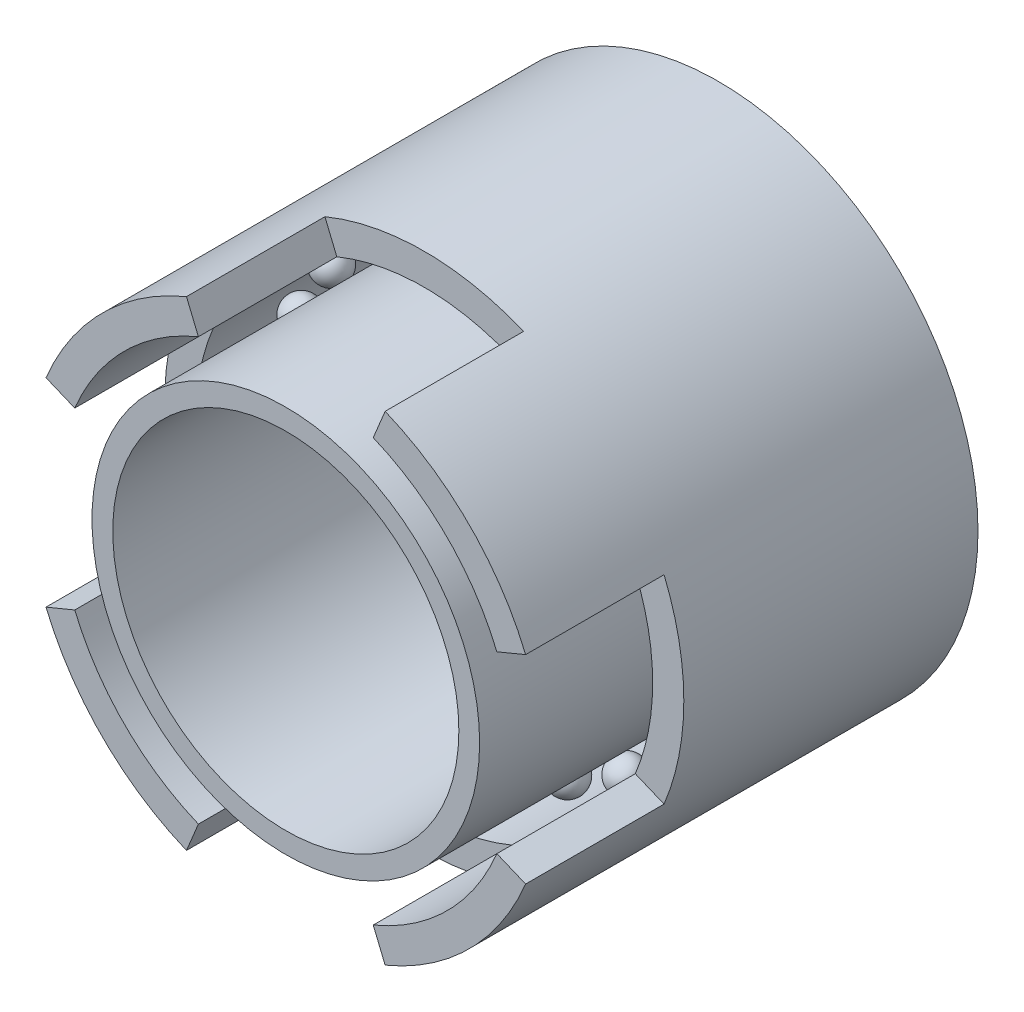
ISO-10303-21;
HEADER;
FILE_DESCRIPTION(('STEP AP214'),'2;1');
FILE_NAME('part.step','',(''),(''),'','','');
FILE_SCHEMA(('AUTOMOTIVE_DESIGN { 1 0 10303 214 1 1 1 1 }'));
ENDSEC;
DATA;
#1=APPLICATION_CONTEXT('core data for automotive mechanical design processes');
#2=APPLICATION_PROTOCOL_DEFINITION('international standard','automotive_design',2000,#1);
#3=PRODUCT_CONTEXT('',#1,'mechanical');
#4=PRODUCT('Part','Part','',(#3));
#5=PRODUCT_RELATED_PRODUCT_CATEGORY('part','',(#4));
#6=PRODUCT_DEFINITION_FORMATION('','',#4);
#7=PRODUCT_DEFINITION_CONTEXT('part definition',#1,'design');
#8=PRODUCT_DEFINITION('design','',#6,#7);
#9=PRODUCT_DEFINITION_SHAPE('','',#8);
#10=(LENGTH_UNIT() NAMED_UNIT(*) SI_UNIT(.MILLI.,.METRE.));
#11=(NAMED_UNIT(*) PLANE_ANGLE_UNIT() SI_UNIT($,.RADIAN.));
#12=(NAMED_UNIT(*) SI_UNIT($,.STERADIAN.) SOLID_ANGLE_UNIT());
#13=UNCERTAINTY_MEASURE_WITH_UNIT(LENGTH_MEASURE(1.E-05),#10,'distance_accuracy_value','');
#14=(GEOMETRIC_REPRESENTATION_CONTEXT(3) GLOBAL_UNCERTAINTY_ASSIGNED_CONTEXT((#13)) GLOBAL_UNIT_ASSIGNED_CONTEXT((#10,
#11,#12)) REPRESENTATION_CONTEXT('',''));
#15=CARTESIAN_POINT('',(0.,0.,0.));
#16=DIRECTION('',(0.,0.,1.));
#17=DIRECTION('',(1.,0.,0.));
#18=AXIS2_PLACEMENT_3D('',#15,#16,#17);
#19=CARTESIAN_POINT('',(14.7356696634772,-4.78790931084524,-15.875));
#20=DIRECTION('',(-0.951056516295158,0.309016994374935,0.));
#21=DIRECTION('',(0.,0.,-1.));
#22=AXIS2_PLACEMENT_3D('',#19,#20,#21);
#23=SPHERICAL_SURFACE('',#22,1.27);
#24=CARTESIAN_POINT('',(13.5278278877823,-4.39545772798908,-15.875));
#25=VERTEX_POINT('',#24);
#26=VERTEX_LOOP('',#25);
#27=FACE_BOUND('',#26,.T.);
#28=ADVANCED_FACE('F50',(#27),#23,.T.);
#29=CLOSED_SHELL('',(#28));
#30=MANIFOLD_SOLID_BREP('B2',#29);
#31=CARTESIAN_POINT('',(12.5349093108456,-9.10714469901941,-15.875));
#32=DIRECTION('',(-0.809016994374955,0.587785252292462,0.));
#33=DIRECTION('',(0.,0.,-1.));
#34=AXIS2_PLACEMENT_3D('',#31,#32,#33);
#35=SPHERICAL_SURFACE('',#34,1.27);
#36=CARTESIAN_POINT('',(11.5074577279894,-8.36065742860799,-15.875));
#37=VERTEX_POINT('',#36);
#38=VERTEX_LOOP('',#37);
#39=FACE_BOUND('',#38,.T.);
#40=ADVANCED_FACE('F69',(#39),#35,.T.);
#41=CLOSED_SHELL('',(#40));
#42=MANIFOLD_SOLID_BREP('B7',#41);
#43=CARTESIAN_POINT('',(9.10714469901973,-12.5349093108453,-15.875));
#44=DIRECTION('',(-0.587785252292483,0.80901699437494,0.));
#45=DIRECTION('',(0.,0.,-1.));
#46=AXIS2_PLACEMENT_3D('',#43,#44,#45);
#47=SPHERICAL_SURFACE('',#46,1.27);
#48=CARTESIAN_POINT('',(8.36065742860828,-11.5074577279892,-15.875));
#49=VERTEX_POINT('',#48);
#50=VERTEX_LOOP('',#49);
#51=FACE_BOUND('',#50,.T.);
#52=ADVANCED_FACE('F88',(#51),#47,.T.);
#53=CLOSED_SHELL('',(#52));
#54=MANIFOLD_SOLID_BREP('B46',#53);
#55=CARTESIAN_POINT('',(4.7879093108456,-14.7356696634771,-15.875));
#56=DIRECTION('',(-0.309016994374958,0.95105651629515,0.));
#57=DIRECTION('',(0.,0.,-1.));
#58=AXIS2_PLACEMENT_3D('',#55,#56,#57);
#59=SPHERICAL_SURFACE('',#58,1.27);
#60=CARTESIAN_POINT('',(4.39545772798941,-13.5278278877822,-15.875));
#61=VERTEX_POINT('',#60);
#62=VERTEX_LOOP('',#61);
#63=FACE_BOUND('',#62,.T.);
#64=ADVANCED_FACE('F107',(#63),#59,.T.);
#65=CLOSED_SHELL('',(#64));
#66=MANIFOLD_SOLID_BREP('B65',#65);
#67=CARTESIAN_POINT('',(1.62291035592107E-13,-15.494,-15.875));
#68=DIRECTION('',(0.,1.,0.));
#69=DIRECTION('',(0.,0.,-1.));
#70=AXIS2_PLACEMENT_3D('',#67,#68,#69);
#71=SPHERICAL_SURFACE('',#70,1.27);
#72=CARTESIAN_POINT('',(1.48988491691114E-13,-14.224,-15.875));
#73=VERTEX_POINT('',#72);
#74=VERTEX_LOOP('',#73);
#75=FACE_BOUND('',#74,.T.);
#76=ADVANCED_FACE('F126',(#75),#71,.T.);
#77=CLOSED_SHELL('',(#76));
#78=MANIFOLD_SOLID_BREP('B84',#77);
#79=CARTESIAN_POINT('',(-4.78790931084529,-14.7356696634772,-15.875));
#80=DIRECTION('',(0.309016994374938,0.951056516295157,0.));
#81=DIRECTION('',(0.,0.,-1.));
#82=AXIS2_PLACEMENT_3D('',#79,#80,#81);
#83=SPHERICAL_SURFACE('',#82,1.27);
#84=CARTESIAN_POINT('',(-4.39545772798912,-13.5278278877823,-15.875));
#85=VERTEX_POINT('',#84);
#86=VERTEX_LOOP('',#85);
#87=FACE_BOUND('',#86,.T.);
#88=ADVANCED_FACE('F145',(#87),#83,.T.);
#89=CLOSED_SHELL('',(#88));
#90=MANIFOLD_SOLID_BREP('B103',#89);
#91=CARTESIAN_POINT('',(-9.10714469901946,-12.5349093108455,-15.875));
#92=DIRECTION('',(0.587785252292465,0.809016994374953,0.));
#93=DIRECTION('',(0.,0.,-1.));
#94=AXIS2_PLACEMENT_3D('',#91,#92,#93);
#95=SPHERICAL_SURFACE('',#94,1.27);
#96=CARTESIAN_POINT('',(-8.36065742860803,-11.5074577279893,-15.875));
#97=VERTEX_POINT('',#96);
#98=VERTEX_LOOP('',#97);
#99=FACE_BOUND('',#98,.T.);
#100=ADVANCED_FACE('F164',(#99),#95,.T.);
#101=CLOSED_SHELL('',(#100));
#102=MANIFOLD_SOLID_BREP('B122',#101);
#103=CARTESIAN_POINT('',(-12.5349093108454,-9.10714469901969,-15.875));
#104=DIRECTION('',(0.809016994374942,0.58778525229248,0.));
#105=DIRECTION('',(0.,0.,-1.));
#106=AXIS2_PLACEMENT_3D('',#103,#104,#105);
#107=SPHERICAL_SURFACE('',#106,1.27);
#108=CARTESIAN_POINT('',(-11.5074577279892,-8.36065742860824,-15.875));
#109=VERTEX_POINT('',#108);
#110=VERTEX_LOOP('',#109);
#111=FACE_BOUND('',#110,.T.);
#112=ADVANCED_FACE('F183',(#111),#107,.T.);
#113=CLOSED_SHELL('',(#112));
#114=MANIFOLD_SOLID_BREP('B141',#113);
#115=CARTESIAN_POINT('',(-14.7356696634771,-4.78790931084555,-15.875));
#116=DIRECTION('',(0.951056516295151,0.309016994374955,0.));
#117=DIRECTION('',(0.,0.,-1.));
#118=AXIS2_PLACEMENT_3D('',#115,#116,#117);
#119=SPHERICAL_SURFACE('',#118,1.27);
#120=CARTESIAN_POINT('',(-13.5278278877822,-4.39545772798936,-15.875));
#121=VERTEX_POINT('',#120);
#122=VERTEX_LOOP('',#121);
#123=FACE_BOUND('',#122,.T.);
#124=ADVANCED_FACE('F202',(#123),#119,.T.);
#125=CLOSED_SHELL('',(#124));
#126=MANIFOLD_SOLID_BREP('B160',#125);
#127=CARTESIAN_POINT('',(-15.494,0.,-15.875));
#128=DIRECTION('',(1.,0.,0.));
#129=DIRECTION('',(0.,0.,-1.));
#130=AXIS2_PLACEMENT_3D('',#127,#128,#129);
#131=SPHERICAL_SURFACE('',#130,1.27);
#132=CARTESIAN_POINT('',(-14.224,0.,-15.875));
#133=VERTEX_POINT('',#132);
#134=VERTEX_LOOP('',#133);
#135=FACE_BOUND('',#134,.T.);
#136=ADVANCED_FACE('F221',(#135),#131,.T.);
#137=CLOSED_SHELL('',(#136));
#138=MANIFOLD_SOLID_BREP('B179',#137);
#139=CARTESIAN_POINT('',(-14.7356696634771,4.78790931084534,-15.875));
#140=DIRECTION('',(0.951056516295156,-0.309016994374941,0.));
#141=DIRECTION('',(0.,0.,-1.));
#142=AXIS2_PLACEMENT_3D('',#139,#140,#141);
#143=SPHERICAL_SURFACE('',#142,1.27);
#144=CARTESIAN_POINT('',(-13.5278278877823,4.39545772798916,-15.875));
#145=VERTEX_POINT('',#144);
#146=VERTEX_LOOP('',#145);
#147=FACE_BOUND('',#146,.T.);
#148=ADVANCED_FACE('F240',(#147),#143,.T.);
#149=CLOSED_SHELL('',(#148));
#150=MANIFOLD_SOLID_BREP('B198',#149);
#151=CARTESIAN_POINT('',(-12.5349093108455,9.10714469901951,-15.875));
#152=DIRECTION('',(0.809016994374951,-0.587785252292469,0.));
#153=DIRECTION('',(0.,0.,-1.));
#154=AXIS2_PLACEMENT_3D('',#151,#152,#153);
#155=SPHERICAL_SURFACE('',#154,1.27);
#156=CARTESIAN_POINT('',(-11.5074577279893,8.36065742860807,-15.875));
#157=VERTEX_POINT('',#156);
#158=VERTEX_LOOP('',#157);
#159=FACE_BOUND('',#158,.T.);
#160=ADVANCED_FACE('F259',(#159),#155,.T.);
#161=CLOSED_SHELL('',(#160));
#162=MANIFOLD_SOLID_BREP('B217',#161);
#163=CARTESIAN_POINT('',(-9.10714469901964,12.5349093108454,-15.875));
#164=DIRECTION('',(0.587785252292477,-0.809016994374945,0.));
#165=DIRECTION('',(0.,0.,-1.));
#166=AXIS2_PLACEMENT_3D('',#163,#164,#165);
#167=SPHERICAL_SURFACE('',#166,1.27);
#168=CARTESIAN_POINT('',(-8.36065742860819,11.5074577279892,-15.875));
#169=VERTEX_POINT('',#168);
#170=VERTEX_LOOP('',#169);
#171=FACE_BOUND('',#170,.T.);
#172=ADVANCED_FACE('F278',(#171),#167,.T.);
#173=CLOSED_SHELL('',(#172));
#174=MANIFOLD_SOLID_BREP('B236',#173);
#175=CARTESIAN_POINT('',(-4.7879093108455,14.7356696634771,-15.875));
#176=DIRECTION('',(0.309016994374952,-0.951056516295152,0.));
#177=DIRECTION('',(0.,0.,-1.));
#178=AXIS2_PLACEMENT_3D('',#175,#176,#177);
#179=SPHERICAL_SURFACE('',#178,1.27);
#180=CARTESIAN_POINT('',(-4.39545772798931,13.5278278877822,-15.875));
#181=VERTEX_POINT('',#180);
#182=VERTEX_LOOP('',#181);
#183=FACE_BOUND('',#182,.T.);
#184=ADVANCED_FACE('F297',(#183),#179,.T.);
#185=CLOSED_SHELL('',(#184));
#186=MANIFOLD_SOLID_BREP('B255',#185);
#187=CARTESIAN_POINT('',(0.,15.494,-15.875));
#188=DIRECTION('',(0.,-1.,0.));
#189=DIRECTION('',(0.,0.,-1.));
#190=AXIS2_PLACEMENT_3D('',#187,#188,#189);
#191=SPHERICAL_SURFACE('',#190,1.27);
#192=CARTESIAN_POINT('',(0.,14.224,-15.875));
#193=VERTEX_POINT('',#192);
#194=VERTEX_LOOP('',#193);
#195=FACE_BOUND('',#194,.T.);
#196=ADVANCED_FACE('F316',(#195),#191,.T.);
#197=CLOSED_SHELL('',(#196));
#198=MANIFOLD_SOLID_BREP('B274',#197);
#199=CARTESIAN_POINT('',(4.78790931084539,14.7356696634771,-15.875));
#200=DIRECTION('',(-0.309016994374945,-0.951056516295155,0.));
#201=DIRECTION('',(0.,0.,-1.));
#202=AXIS2_PLACEMENT_3D('',#199,#200,#201);
#203=SPHERICAL_SURFACE('',#202,1.27);
#204=CARTESIAN_POINT('',(4.39545772798921,13.5278278877823,-15.875));
#205=VERTEX_POINT('',#204);
#206=VERTEX_LOOP('',#205);
#207=FACE_BOUND('',#206,.T.);
#208=ADVANCED_FACE('F335',(#207),#203,.T.);
#209=CLOSED_SHELL('',(#208));
#210=MANIFOLD_SOLID_BREP('B293',#209);
#211=CARTESIAN_POINT('',(9.10714469901955,12.5349093108455,-15.875));
#212=DIRECTION('',(-0.587785252292471,-0.809016994374949,0.));
#213=DIRECTION('',(0.,0.,-1.));
#214=AXIS2_PLACEMENT_3D('',#211,#212,#213);
#215=SPHERICAL_SURFACE('',#214,1.27);
#216=CARTESIAN_POINT('',(8.36065742860811,11.5074577279893,-15.875));
#217=VERTEX_POINT('',#216);
#218=VERTEX_LOOP('',#217);
#219=FACE_BOUND('',#218,.T.);
#220=ADVANCED_FACE('F354',(#219),#215,.T.);
#221=CLOSED_SHELL('',(#220));
#222=MANIFOLD_SOLID_BREP('B312',#221);
#223=CARTESIAN_POINT('',(12.5349093108454,9.1071446990196,-15.875));
#224=DIRECTION('',(-0.809016994374947,-0.587785252292474,0.));
#225=DIRECTION('',(0.,0.,-1.));
#226=AXIS2_PLACEMENT_3D('',#223,#224,#225);
#227=SPHERICAL_SURFACE('',#226,1.27);
#228=CARTESIAN_POINT('',(11.5074577279892,8.36065742860816,-15.875));
#229=VERTEX_POINT('',#228);
#230=VERTEX_LOOP('',#229);
#231=FACE_BOUND('',#230,.T.);
#232=ADVANCED_FACE('F373',(#231),#227,.T.);
#233=CLOSED_SHELL('',(#232));
#234=MANIFOLD_SOLID_BREP('B331',#233);
#235=CARTESIAN_POINT('',(14.7356696634771,4.78790931084545,-15.875));
#236=DIRECTION('',(-0.951056516295154,-0.309016994374948,0.));
#237=DIRECTION('',(0.,0.,-1.));
#238=AXIS2_PLACEMENT_3D('',#235,#236,#237);
#239=SPHERICAL_SURFACE('',#238,1.27);
#240=CARTESIAN_POINT('',(13.5278278877823,4.39545772798926,-15.875));
#241=VERTEX_POINT('',#240);
#242=VERTEX_LOOP('',#241);
#243=FACE_BOUND('',#242,.T.);
#244=ADVANCED_FACE('F392',(#243),#239,.T.);
#245=CLOSED_SHELL('',(#244));
#246=MANIFOLD_SOLID_BREP('B350',#245);
#247=CARTESIAN_POINT('',(15.494,0.,-15.875));
#248=DIRECTION('',(-1.,0.,0.));
#249=DIRECTION('',(0.,0.,-1.));
#250=AXIS2_PLACEMENT_3D('',#247,#248,#249);
#251=SPHERICAL_SURFACE('',#250,1.27);
#252=CARTESIAN_POINT('',(14.224,0.,-15.875));
#253=VERTEX_POINT('',#252);
#254=VERTEX_LOOP('',#253);
#255=FACE_BOUND('',#254,.T.);
#256=ADVANCED_FACE('F415',(#255),#251,.T.);
#257=CLOSED_SHELL('',(#256));
#258=MANIFOLD_SOLID_BREP('B369',#257);
#259=CARTESIAN_POINT('',(0.,0.,-31.75));
#260=DIRECTION('',(0.,0.,1.));
#261=DIRECTION('',(1.,0.,0.));
#262=AXIS2_PLACEMENT_3D('',#259,#260,#261);
#263=CYLINDRICAL_SURFACE('',#262,12.7);
#264=CARTESIAN_POINT('',(0.,0.,-31.75));
#265=DIRECTION('',(0.,0.,1.));
#266=DIRECTION('',(1.,0.,0.));
#267=AXIS2_PLACEMENT_3D('',#264,#265,#266);
#268=CIRCLE('',#267,12.7);
#269=CARTESIAN_POINT('',(12.7,0.,-31.75));
#270=VERTEX_POINT('',#269);
#271=EDGE_CURVE('E444',#270,#270,#268,.T.);
#272=ORIENTED_EDGE('',*,*,#271,.F.);
#273=EDGE_LOOP('',(#272));
#274=FACE_BOUND('',#273,.T.);
#275=CARTESIAN_POINT('',(0.,0.,0.));
#276=DIRECTION('',(0.,0.,1.));
#277=DIRECTION('',(1.,0.,0.));
#278=AXIS2_PLACEMENT_3D('',#275,#276,#277);
#279=CIRCLE('',#278,12.7);
#280=CARTESIAN_POINT('',(12.7,0.,0.));
#281=VERTEX_POINT('',#280);
#282=EDGE_CURVE('E457',#281,#281,#279,.T.);
#283=ORIENTED_EDGE('',*,*,#282,.T.);
#284=EDGE_LOOP('',(#283));
#285=FACE_BOUND('',#284,.T.);
#286=ADVANCED_FACE('F437',(#274,#285),#263,.F.);
#287=CARTESIAN_POINT('',(0.,0.,-31.75));
#288=DIRECTION('',(0.,0.,1.));
#289=DIRECTION('',(1.,0.,0.));
#290=AXIS2_PLACEMENT_3D('',#287,#288,#289);
#291=CYLINDRICAL_SURFACE('',#290,14.224);
#292=CARTESIAN_POINT('',(14.224,0.,-15.875));
#293=VERTEX_POINT('',#292);
#294=VERTEX_LOOP('',#293);
#295=FACE_BOUND('',#294,.T.);
#296=CARTESIAN_POINT('',(0.,0.,-31.75));
#297=DIRECTION('',(0.,0.,1.));
#298=DIRECTION('',(1.,0.,0.));
#299=AXIS2_PLACEMENT_3D('',#296,#297,#298);
#300=CIRCLE('',#299,14.224);
#301=CARTESIAN_POINT('',(14.224,0.,-31.75));
#302=VERTEX_POINT('',#301);
#303=EDGE_CURVE('E413',#302,#302,#300,.T.);
#304=ORIENTED_EDGE('',*,*,#303,.T.);
#305=EDGE_LOOP('',(#304));
#306=FACE_BOUND('',#305,.T.);
#307=CARTESIAN_POINT('',(0.,0.,0.));
#308=DIRECTION('',(0.,0.,1.));
#309=DIRECTION('',(1.,0.,0.));
#310=AXIS2_PLACEMENT_3D('',#307,#308,#309);
#311=CIRCLE('',#310,14.224);
#312=CARTESIAN_POINT('',(14.224,0.,0.));
#313=VERTEX_POINT('',#312);
#314=EDGE_CURVE('E440',#313,#313,#311,.T.);
#315=ORIENTED_EDGE('',*,*,#314,.F.);
#316=EDGE_LOOP('',(#315));
#317=FACE_BOUND('',#316,.T.);
#318=ADVANCED_FACE('F448',(#295,#306,#317),#291,.T.);
#319=CARTESIAN_POINT('',(0.,0.,-31.75));
#320=DIRECTION('',(0.,0.,1.));
#321=DIRECTION('',(1.,0.,0.));
#322=AXIS2_PLACEMENT_3D('',#319,#320,#321);
#323=PLANE('',#322);
#324=ORIENTED_EDGE('',*,*,#271,.T.);
#325=EDGE_LOOP('',(#324));
#326=FACE_BOUND('',#325,.T.);
#327=ORIENTED_EDGE('',*,*,#303,.F.);
#328=EDGE_LOOP('',(#327));
#329=FACE_BOUND('',#328,.T.);
#330=ADVANCED_FACE('F451',(#326,#329),#323,.F.);
#331=CARTESIAN_POINT('',(0.,0.,0.));
#332=DIRECTION('',(0.,0.,1.));
#333=DIRECTION('',(1.,0.,0.));
#334=AXIS2_PLACEMENT_3D('',#331,#332,#333);
#335=PLANE('',#334);
#336=ORIENTED_EDGE('',*,*,#282,.F.);
#337=EDGE_LOOP('',(#336));
#338=FACE_BOUND('',#337,.T.);
#339=ORIENTED_EDGE('',*,*,#314,.T.);
#340=EDGE_LOOP('',(#339));
#341=FACE_BOUND('',#340,.T.);
#342=ADVANCED_FACE('F464',(#338,#341),#335,.T.);
#343=CLOSED_SHELL('',(#286,#318,#330,#342));
#344=MANIFOLD_SOLID_BREP('B388',#343);
#345=CARTESIAN_POINT('',(0.,0.,0.));
#346=DIRECTION('',(0.,0.,1.));
#347=DIRECTION('',(1.,0.,0.));
#348=AXIS2_PLACEMENT_3D('',#345,#346,#347);
#349=PLANE('',#348);
#350=DIRECTION('',(0.38268343236509,0.923879532511287,0.));
#351=VECTOR('',#350,1.);
#352=CARTESIAN_POINT('',(7.29011938655497,17.59990509434,0.));
#353=LINE('',#352,#351);
#354=CARTESIAN_POINT('',(6.41530506016838,15.4879164830192,0.));
#355=VERTEX_POINT('',#354);
#356=CARTESIAN_POINT('',(7.29011938655497,17.59990509434,0.));
#357=VERTEX_POINT('',#356);
#358=EDGE_CURVE('E639',#355,#357,#353,.T.);
#359=ORIENTED_EDGE('',*,*,#358,.F.);
#360=CARTESIAN_POINT('',(0.,0.,0.));
#361=DIRECTION('',(0.,0.,1.));
#362=DIRECTION('',(1.,0.,0.));
#363=AXIS2_PLACEMENT_3D('',#360,#361,#362);
#364=CIRCLE('',#363,16.764);
#365=CARTESIAN_POINT('',(15.4879164830192,6.41530506016833,0.));
#366=VERTEX_POINT('',#365);
#367=EDGE_CURVE('E761',#366,#355,#364,.T.);
#368=ORIENTED_EDGE('',*,*,#367,.F.);
#369=DIRECTION('',(-0.923879532511289,-0.382683432365085,0.));
#370=VECTOR('',#369,1.);
#371=CARTESIAN_POINT('',(17.59990509434,7.29011938655491,0.));
#372=LINE('',#371,#370);
#373=CARTESIAN_POINT('',(17.59990509434,7.29011938655487,0.));
#374=VERTEX_POINT('',#373);
#375=EDGE_CURVE('E673',#374,#366,#372,.T.);
#376=ORIENTED_EDGE('',*,*,#375,.F.);
#377=CARTESIAN_POINT('',(0.,0.,0.));
#378=DIRECTION('',(0.,0.,1.));
#379=DIRECTION('',(1.,0.,0.));
#380=AXIS2_PLACEMENT_3D('',#377,#378,#379);
#381=CIRCLE('',#380,19.05);
#382=EDGE_CURVE('E503',#374,#357,#381,.T.);
#383=ORIENTED_EDGE('',*,*,#382,.T.);
#384=EDGE_LOOP('',(#359,#368,#376,#383));
#385=FACE_BOUND('',#384,.T.);
#386=ADVANCED_FACE('F499',(#385),#349,.T.);
#387=DIRECTION('',(0.923879532511285,-0.382683432365094,0.));
#388=VECTOR('',#387,1.);
#389=CARTESIAN_POINT('',(17.59990509434,-7.29011938655503,0.));
#390=LINE('',#389,#388);
#391=CARTESIAN_POINT('',(15.4879164830192,-6.41530506016843,0.));
#392=VERTEX_POINT('',#391);
#393=CARTESIAN_POINT('',(17.59990509434,-7.29011938655503,0.));
#394=VERTEX_POINT('',#393);
#395=EDGE_CURVE('E661',#392,#394,#390,.T.);
#396=ORIENTED_EDGE('',*,*,#395,.F.);
#397=CARTESIAN_POINT('',(6.41530506016828,-15.4879164830193,0.));
#398=VERTEX_POINT('',#397);
#399=EDGE_CURVE('E766',#398,#392,#364,.T.);
#400=ORIENTED_EDGE('',*,*,#399,.F.);
#401=DIRECTION('',(-0.382683432365082,0.92387953251129,0.));
#402=VECTOR('',#401,1.);
#403=CARTESIAN_POINT('',(7.29011938655485,-17.5999050943401,0.));
#404=LINE('',#403,#402);
#405=CARTESIAN_POINT('',(7.29011938655481,-17.5999050943401,0.));
#406=VERTEX_POINT('',#405);
#407=EDGE_CURVE('E709',#406,#398,#404,.T.);
#408=ORIENTED_EDGE('',*,*,#407,.F.);
#409=EDGE_CURVE('E764',#406,#394,#381,.T.);
#410=ORIENTED_EDGE('',*,*,#409,.T.);
#411=EDGE_LOOP('',(#396,#400,#408,#410));
#412=FACE_BOUND('',#411,.T.);
#413=ADVANCED_FACE('F814',(#412),#349,.T.);
#414=DIRECTION('',(-0.382683432365097,-0.923879532511284,0.));
#415=VECTOR('',#414,1.);
#416=CARTESIAN_POINT('',(-7.29011938655509,-17.59990509434,0.));
#417=LINE('',#416,#415);
#418=CARTESIAN_POINT('',(-6.41530506016848,-15.4879164830192,0.));
#419=VERTEX_POINT('',#418);
#420=CARTESIAN_POINT('',(-7.29011938655509,-17.59990509434,0.));
#421=VERTEX_POINT('',#420);
#422=EDGE_CURVE('E698',#419,#421,#417,.T.);
#423=ORIENTED_EDGE('',*,*,#422,.F.);
#424=CARTESIAN_POINT('',(-15.4879164830193,-6.41530506016822,0.));
#425=VERTEX_POINT('',#424);
#426=EDGE_CURVE('E775',#425,#419,#364,.T.);
#427=ORIENTED_EDGE('',*,*,#426,.F.);
#428=DIRECTION('',(0.923879532511291,0.382683432365079,0.));
#429=VECTOR('',#428,1.);
#430=CARTESIAN_POINT('',(-17.5999050943401,-7.29011938655479,0.));
#431=LINE('',#430,#429);
#432=CARTESIAN_POINT('',(-17.5999050943401,-7.29011938655475,0.));
#433=VERTEX_POINT('',#432);
#434=EDGE_CURVE('E743',#433,#425,#431,.T.);
#435=ORIENTED_EDGE('',*,*,#434,.F.);
#436=EDGE_CURVE('E773',#433,#421,#381,.T.);
#437=ORIENTED_EDGE('',*,*,#436,.T.);
#438=EDGE_LOOP('',(#423,#427,#435,#437));
#439=FACE_BOUND('',#438,.T.);
#440=ADVANCED_FACE('F799',(#439),#349,.T.);
#441=CARTESIAN_POINT('',(0.,0.,-31.75));
#442=DIRECTION('',(0.,0.,1.));
#443=DIRECTION('',(1.,0.,0.));
#444=AXIS2_PLACEMENT_3D('',#441,#442,#443);
#445=CYLINDRICAL_SURFACE('',#444,16.764);
#446=ORIENTED_EDGE('',*,*,#367,.T.);
#447=DIRECTION('',(0.,0.,1.));
#448=VECTOR('',#447,1.);
#449=CARTESIAN_POINT('',(6.41530506016838,15.4879164830192,-10.16));
#450=LINE('',#449,#448);
#451=CARTESIAN_POINT('',(6.41530506016838,15.4879164830192,-10.16));
#452=VERTEX_POINT('',#451);
#453=EDGE_CURVE('E651',#452,#355,#450,.T.);
#454=ORIENTED_EDGE('',*,*,#453,.F.);
#455=CARTESIAN_POINT('',(0.,0.,-10.16));
#456=DIRECTION('',(0.,0.,-1.));
#457=DIRECTION('',(-1.,0.,0.));
#458=AXIS2_PLACEMENT_3D('',#455,#456,#457);
#459=CIRCLE('',#458,16.764);
#460=CARTESIAN_POINT('',(-6.41530506016838,15.4879164830192,-10.16));
#461=VERTEX_POINT('',#460);
#462=EDGE_CURVE('E628',#461,#452,#459,.T.);
#463=ORIENTED_EDGE('',*,*,#462,.F.);
#464=DIRECTION('',(0.,0.,1.));
#465=VECTOR('',#464,1.);
#466=CARTESIAN_POINT('',(-6.41530506016838,15.4879164830192,-10.16));
#467=LINE('',#466,#465);
#468=CARTESIAN_POINT('',(-6.41530506016838,15.4879164830192,0.));
#469=VERTEX_POINT('',#468);
#470=EDGE_CURVE('E624',#461,#469,#467,.T.);
#471=ORIENTED_EDGE('',*,*,#470,.T.);
#472=CARTESIAN_POINT('',(-15.4879164830191,6.41530506016854,0.));
#473=VERTEX_POINT('',#472);
#474=EDGE_CURVE('E765',#469,#473,#364,.T.);
#475=ORIENTED_EDGE('',*,*,#474,.T.);
#476=DIRECTION('',(0.,0.,1.));
#477=VECTOR('',#476,1.);
#478=CARTESIAN_POINT('',(-15.4879164830191,6.41530506016854,-10.16));
#479=LINE('',#478,#477);
#480=CARTESIAN_POINT('',(-15.4879164830191,6.41530506016854,-10.16));
#481=VERTEX_POINT('',#480);
#482=EDGE_CURVE('E750',#481,#473,#479,.T.);
#483=ORIENTED_EDGE('',*,*,#482,.F.);
#484=CARTESIAN_POINT('',(0.,0.,-10.16));
#485=DIRECTION('',(0.,0.,-1.));
#486=DIRECTION('',(-1.,0.,0.));
#487=AXIS2_PLACEMENT_3D('',#484,#485,#486);
#488=CIRCLE('',#487,16.764);
#489=CARTESIAN_POINT('',(-15.4879164830193,-6.41530506016822,-10.16));
#490=VERTEX_POINT('',#489);
#491=EDGE_CURVE('E736',#490,#481,#488,.T.);
#492=ORIENTED_EDGE('',*,*,#491,.F.);
#493=DIRECTION('',(0.,0.,1.));
#494=VECTOR('',#493,1.);
#495=CARTESIAN_POINT('',(-15.4879164830193,-6.41530506016822,-10.16));
#496=LINE('',#495,#494);
#497=EDGE_CURVE('E753',#490,#425,#496,.T.);
#498=ORIENTED_EDGE('',*,*,#497,.T.);
#499=ORIENTED_EDGE('',*,*,#426,.T.);
#500=DIRECTION('',(0.,0.,1.));
#501=VECTOR('',#500,1.);
#502=CARTESIAN_POINT('',(-6.41530506016848,-15.4879164830192,-10.16));
#503=LINE('',#502,#501);
#504=CARTESIAN_POINT('',(-6.41530506016848,-15.4879164830192,-10.16));
#505=VERTEX_POINT('',#504);
#506=EDGE_CURVE('E718',#505,#419,#503,.T.);
#507=ORIENTED_EDGE('',*,*,#506,.F.);
#508=CARTESIAN_POINT('',(0.,0.,-10.16));
#509=DIRECTION('',(0.,0.,-1.));
#510=DIRECTION('',(-1.,0.,0.));
#511=AXIS2_PLACEMENT_3D('',#508,#509,#510);
#512=CIRCLE('',#511,16.764);
#513=CARTESIAN_POINT('',(6.41530506016828,-15.4879164830193,-10.16));
#514=VERTEX_POINT('',#513);
#515=EDGE_CURVE('E702',#514,#505,#512,.T.);
#516=ORIENTED_EDGE('',*,*,#515,.F.);
#517=DIRECTION('',(0.,0.,1.));
#518=VECTOR('',#517,1.);
#519=CARTESIAN_POINT('',(6.41530506016828,-15.4879164830193,-10.16));
#520=LINE('',#519,#518);
#521=EDGE_CURVE('E721',#514,#398,#520,.T.);
#522=ORIENTED_EDGE('',*,*,#521,.T.);
#523=ORIENTED_EDGE('',*,*,#399,.T.);
#524=DIRECTION('',(0.,0.,1.));
#525=VECTOR('',#524,1.);
#526=CARTESIAN_POINT('',(15.4879164830192,-6.41530506016843,-10.16));
#527=LINE('',#526,#525);
#528=CARTESIAN_POINT('',(15.4879164830192,-6.41530506016843,-10.16));
#529=VERTEX_POINT('',#528);
#530=EDGE_CURVE('E684',#529,#392,#527,.T.);
#531=ORIENTED_EDGE('',*,*,#530,.F.);
#532=CARTESIAN_POINT('',(0.,0.,-10.16));
#533=DIRECTION('',(0.,0.,-1.));
#534=DIRECTION('',(-1.,0.,0.));
#535=AXIS2_PLACEMENT_3D('',#532,#533,#534);
#536=CIRCLE('',#535,16.764);
#537=CARTESIAN_POINT('',(15.4879164830192,6.41530506016833,-10.16));
#538=VERTEX_POINT('',#537);
#539=EDGE_CURVE('E665',#538,#529,#536,.T.);
#540=ORIENTED_EDGE('',*,*,#539,.F.);
#541=DIRECTION('',(0.,0.,1.));
#542=VECTOR('',#541,1.);
#543=CARTESIAN_POINT('',(15.4879164830192,6.41530506016833,-10.16));
#544=LINE('',#543,#542);
#545=EDGE_CURVE('E687',#538,#366,#544,.T.);
#546=ORIENTED_EDGE('',*,*,#545,.T.);
#547=EDGE_LOOP('',(#446,#454,#463,#471,#475,#483,#492,#498,#499,#507,#516,#522,#523,#531,#540,#546));
#548=FACE_BOUND('',#547,.T.);
#549=CARTESIAN_POINT('',(16.764,0.,-15.875));
#550=VERTEX_POINT('',#549);
#551=VERTEX_LOOP('',#550);
#552=FACE_BOUND('',#551,.T.);
#553=CARTESIAN_POINT('',(0.,0.,-31.75));
#554=DIRECTION('',(0.,0.,1.));
#555=DIRECTION('',(1.,0.,0.));
#556=AXIS2_PLACEMENT_3D('',#553,#554,#555);
#557=CIRCLE('',#556,16.764);
#558=CARTESIAN_POINT('',(16.764,0.,-31.75));
#559=VERTEX_POINT('',#558);
#560=EDGE_CURVE('E509',#559,#559,#557,.T.);
#561=ORIENTED_EDGE('',*,*,#560,.F.);
#562=EDGE_LOOP('',(#561));
#563=FACE_BOUND('',#562,.T.);
#564=ADVANCED_FACE('F501',(#548,#552,#563),#445,.F.);
#565=CARTESIAN_POINT('',(0.,0.,-31.75));
#566=DIRECTION('',(0.,0.,1.));
#567=DIRECTION('',(1.,0.,0.));
#568=AXIS2_PLACEMENT_3D('',#565,#566,#567);
#569=CYLINDRICAL_SURFACE('',#568,19.05);
#570=DIRECTION('',(0.,0.,1.));
#571=VECTOR('',#570,1.);
#572=CARTESIAN_POINT('',(7.29011938655497,17.59990509434,-10.16));
#573=LINE('',#572,#571);
#574=CARTESIAN_POINT('',(7.29011938655497,17.59990509434,-10.16));
#575=VERTEX_POINT('',#574);
#576=EDGE_CURVE('E778',#575,#357,#573,.T.);
#577=ORIENTED_EDGE('',*,*,#576,.T.);
#578=ORIENTED_EDGE('',*,*,#382,.F.);
#579=DIRECTION('',(0.,0.,1.));
#580=VECTOR('',#579,1.);
#581=CARTESIAN_POINT('',(17.59990509434,7.29011938655491,-10.16));
#582=LINE('',#581,#580);
#583=CARTESIAN_POINT('',(17.59990509434,7.29011938655491,-10.16));
#584=VERTEX_POINT('',#583);
#585=EDGE_CURVE('E672',#584,#374,#582,.T.);
#586=ORIENTED_EDGE('',*,*,#585,.F.);
#587=CARTESIAN_POINT('',(0.,0.,-10.16));
#588=DIRECTION('',(0.,0.,1.));
#589=DIRECTION('',(-1.,0.,0.));
#590=AXIS2_PLACEMENT_3D('',#587,#588,#589);
#591=CIRCLE('',#590,19.05);
#592=CARTESIAN_POINT('',(17.59990509434,-7.29011938655503,-10.16));
#593=VERTEX_POINT('',#592);
#594=EDGE_CURVE('E656',#593,#584,#591,.T.);
#595=ORIENTED_EDGE('',*,*,#594,.F.);
#596=DIRECTION('',(0.,0.,1.));
#597=VECTOR('',#596,1.);
#598=CARTESIAN_POINT('',(17.59990509434,-7.29011938655503,-10.16));
#599=LINE('',#598,#597);
#600=EDGE_CURVE('E679',#593,#394,#599,.T.);
#601=ORIENTED_EDGE('',*,*,#600,.T.);
#602=ORIENTED_EDGE('',*,*,#409,.F.);
#603=DIRECTION('',(0.,0.,1.));
#604=VECTOR('',#603,1.);
#605=CARTESIAN_POINT('',(7.29011938655485,-17.5999050943401,-10.16));
#606=LINE('',#605,#604);
#607=CARTESIAN_POINT('',(7.29011938655485,-17.5999050943401,-10.16));
#608=VERTEX_POINT('',#607);
#609=EDGE_CURVE('E517',#608,#406,#606,.T.);
#610=ORIENTED_EDGE('',*,*,#609,.F.);
#611=CARTESIAN_POINT('',(0.,0.,-10.16));
#612=DIRECTION('',(0.,0.,1.));
#613=DIRECTION('',(-1.,0.,0.));
#614=AXIS2_PLACEMENT_3D('',#611,#612,#613);
#615=CIRCLE('',#614,19.05);
#616=CARTESIAN_POINT('',(-7.29011938655509,-17.59990509434,-10.16));
#617=VERTEX_POINT('',#616);
#618=EDGE_CURVE('E693',#617,#608,#615,.T.);
#619=ORIENTED_EDGE('',*,*,#618,.F.);
#620=DIRECTION('',(0.,0.,1.));
#621=VECTOR('',#620,1.);
#622=CARTESIAN_POINT('',(-7.29011938655509,-17.59990509434,-10.16));
#623=LINE('',#622,#621);
#624=EDGE_CURVE('E676',#617,#421,#623,.T.);
#625=ORIENTED_EDGE('',*,*,#624,.T.);
#626=ORIENTED_EDGE('',*,*,#436,.F.);
#627=DIRECTION('',(0.,0.,1.));
#628=VECTOR('',#627,1.);
#629=CARTESIAN_POINT('',(-17.5999050943401,-7.29011938655479,-10.16));
#630=LINE('',#629,#628);
#631=CARTESIAN_POINT('',(-17.5999050943401,-7.29011938655479,-10.16));
#632=VERTEX_POINT('',#631);
#633=EDGE_CURVE('E525',#632,#433,#630,.T.);
#634=ORIENTED_EDGE('',*,*,#633,.F.);
#635=CARTESIAN_POINT('',(0.,0.,-10.16));
#636=DIRECTION('',(0.,0.,1.));
#637=DIRECTION('',(-1.,0.,0.));
#638=AXIS2_PLACEMENT_3D('',#635,#636,#637);
#639=CIRCLE('',#638,19.05);
#640=CARTESIAN_POINT('',(-17.5999050943399,7.29011938655516,-10.16));
#641=VERTEX_POINT('',#640);
#642=EDGE_CURVE('E727',#641,#632,#639,.T.);
#643=ORIENTED_EDGE('',*,*,#642,.F.);
#644=DIRECTION('',(0.,0.,1.));
#645=VECTOR('',#644,1.);
#646=CARTESIAN_POINT('',(-17.5999050943399,7.29011938655516,-10.16));
#647=LINE('',#646,#645);
#648=CARTESIAN_POINT('',(-17.5999050943399,7.29011938655516,0.));
#649=VERTEX_POINT('',#648);
#650=EDGE_CURVE('E712',#641,#649,#647,.T.);
#651=ORIENTED_EDGE('',*,*,#650,.T.);
#652=CARTESIAN_POINT('',(-7.29011938655493,17.59990509434,0.));
#653=VERTEX_POINT('',#652);
#654=EDGE_CURVE('E646',#653,#649,#381,.T.);
#655=ORIENTED_EDGE('',*,*,#654,.F.);
#656=DIRECTION('',(0.,0.,1.));
#657=VECTOR('',#656,1.);
#658=CARTESIAN_POINT('',(-7.29011938655497,17.59990509434,-10.16));
#659=LINE('',#658,#657);
#660=CARTESIAN_POINT('',(-7.29011938655497,17.59990509434,-10.16));
#661=VERTEX_POINT('',#660);
#662=EDGE_CURVE('E621',#661,#653,#659,.T.);
#663=ORIENTED_EDGE('',*,*,#662,.F.);
#664=CARTESIAN_POINT('',(0.,0.,-10.16));
#665=DIRECTION('',(0.,0.,1.));
#666=DIRECTION('',(-1.,0.,0.));
#667=AXIS2_PLACEMENT_3D('',#664,#665,#666);
#668=CIRCLE('',#667,19.05);
#669=EDGE_CURVE('E629',#575,#661,#668,.T.);
#670=ORIENTED_EDGE('',*,*,#669,.F.);
#671=EDGE_LOOP('',(#577,#578,#586,#595,#601,#602,#610,#619,#625,#626,#634,#643,#651,#655,#663,#670));
#672=FACE_BOUND('',#671,.T.);
#673=CARTESIAN_POINT('',(0.,0.,-31.75));
#674=DIRECTION('',(0.,0.,1.));
#675=DIRECTION('',(1.,0.,0.));
#676=AXIS2_PLACEMENT_3D('',#673,#674,#675);
#677=CIRCLE('',#676,19.05);
#678=CARTESIAN_POINT('',(19.05,0.,-31.75));
#679=VERTEX_POINT('',#678);
#680=EDGE_CURVE('E435',#679,#679,#677,.T.);
#681=ORIENTED_EDGE('',*,*,#680,.T.);
#682=EDGE_LOOP('',(#681));
#683=FACE_BOUND('',#682,.T.);
#684=ADVANCED_FACE('F642',(#672,#683),#569,.T.);
#685=CARTESIAN_POINT('',(0.,0.,-31.75));
#686=DIRECTION('',(0.,0.,1.));
#687=DIRECTION('',(1.,0.,0.));
#688=AXIS2_PLACEMENT_3D('',#685,#686,#687);
#689=PLANE('',#688);
#690=ORIENTED_EDGE('',*,*,#560,.T.);
#691=EDGE_LOOP('',(#690));
#692=FACE_BOUND('',#691,.T.);
#693=ORIENTED_EDGE('',*,*,#680,.F.);
#694=EDGE_LOOP('',(#693));
#695=FACE_BOUND('',#694,.T.);
#696=ADVANCED_FACE('F803',(#692,#695),#689,.F.);
#697=DIRECTION('',(0.382683432365088,-0.923879532511287,0.));
#698=VECTOR('',#697,1.);
#699=CARTESIAN_POINT('',(-7.29011938655497,17.59990509434,0.));
#700=LINE('',#699,#698);
#701=EDGE_CURVE('E683',#653,#469,#700,.T.);
#702=ORIENTED_EDGE('',*,*,#701,.F.);
#703=ORIENTED_EDGE('',*,*,#654,.T.);
#704=DIRECTION('',(-0.923879532511283,0.3826834323651,0.));
#705=VECTOR('',#704,1.);
#706=CARTESIAN_POINT('',(-17.5999050943399,7.29011938655516,0.));
#707=LINE('',#706,#705);
#708=EDGE_CURVE('E732',#473,#649,#707,.T.);
#709=ORIENTED_EDGE('',*,*,#708,.F.);
#710=ORIENTED_EDGE('',*,*,#474,.F.);
#711=EDGE_LOOP('',(#702,#703,#709,#710));
#712=FACE_BOUND('',#711,.T.);
#713=ADVANCED_FACE('F806',(#712),#349,.T.);
#714=CARTESIAN_POINT('',(-17.5999050943399,7.29011938655516,-10.16));
#715=DIRECTION('',(0.3826834323651,0.923879532511283,0.));
#716=DIRECTION('',(-0.923879532511283,0.3826834323651,0.));
#717=AXIS2_PLACEMENT_3D('',#714,#715,#716);
#718=PLANE('',#717);
#719=ORIENTED_EDGE('',*,*,#708,.T.);
#720=ORIENTED_EDGE('',*,*,#650,.F.);
#721=DIRECTION('',(-0.923879532511283,0.3826834323651,0.));
#722=VECTOR('',#721,1.);
#723=CARTESIAN_POINT('',(-17.5999050943399,7.29011938655516,-10.16));
#724=LINE('',#723,#722);
#725=EDGE_CURVE('E739',#481,#641,#724,.T.);
#726=ORIENTED_EDGE('',*,*,#725,.F.);
#727=ORIENTED_EDGE('',*,*,#482,.T.);
#728=EDGE_LOOP('',(#719,#720,#726,#727));
#729=FACE_BOUND('',#728,.T.);
#730=ADVANCED_FACE('F821',(#729),#718,.F.);
#731=CARTESIAN_POINT('',(-17.5999050943401,-7.29011938655479,-10.16));
#732=DIRECTION('',(0.382683432365079,-0.923879532511291,0.));
#733=DIRECTION('',(0.923879532511291,0.382683432365079,0.));
#734=AXIS2_PLACEMENT_3D('',#731,#732,#733);
#735=PLANE('',#734);
#736=ORIENTED_EDGE('',*,*,#434,.T.);
#737=ORIENTED_EDGE('',*,*,#497,.F.);
#738=DIRECTION('',(0.923879532511291,0.382683432365079,0.));
#739=VECTOR('',#738,1.);
#740=CARTESIAN_POINT('',(-17.5999050943401,-7.29011938655479,-10.16));
#741=LINE('',#740,#739);
#742=EDGE_CURVE('E731',#632,#490,#741,.T.);
#743=ORIENTED_EDGE('',*,*,#742,.F.);
#744=ORIENTED_EDGE('',*,*,#633,.T.);
#745=EDGE_LOOP('',(#736,#737,#743,#744));
#746=FACE_BOUND('',#745,.T.);
#747=ADVANCED_FACE('F826',(#746),#735,.F.);
#748=CARTESIAN_POINT('',(0.,0.,-10.16));
#749=DIRECTION('',(0.,0.,-1.));
#750=DIRECTION('',(-1.,0.,0.));
#751=AXIS2_PLACEMENT_3D('',#748,#749,#750);
#752=PLANE('',#751);
#753=ORIENTED_EDGE('',*,*,#642,.T.);
#754=ORIENTED_EDGE('',*,*,#742,.T.);
#755=ORIENTED_EDGE('',*,*,#491,.T.);
#756=ORIENTED_EDGE('',*,*,#725,.T.);
#757=EDGE_LOOP('',(#753,#754,#755,#756));
#758=FACE_BOUND('',#757,.T.);
#759=ADVANCED_FACE('F843',(#758),#752,.F.);
#760=CARTESIAN_POINT('',(-7.29011938655509,-17.59990509434,-10.16));
#761=DIRECTION('',(-0.923879532511284,0.382683432365097,0.));
#762=DIRECTION('',(-0.382683432365097,-0.923879532511284,0.));
#763=AXIS2_PLACEMENT_3D('',#760,#761,#762);
#764=PLANE('',#763);
#765=ORIENTED_EDGE('',*,*,#422,.T.);
#766=ORIENTED_EDGE('',*,*,#624,.F.);
#767=DIRECTION('',(-0.382683432365097,-0.923879532511284,0.));
#768=VECTOR('',#767,1.);
#769=CARTESIAN_POINT('',(-7.29011938655509,-17.59990509434,-10.16));
#770=LINE('',#769,#768);
#771=EDGE_CURVE('E705',#505,#617,#770,.T.);
#772=ORIENTED_EDGE('',*,*,#771,.F.);
#773=ORIENTED_EDGE('',*,*,#506,.T.);
#774=EDGE_LOOP('',(#765,#766,#772,#773));
#775=FACE_BOUND('',#774,.T.);
#776=ADVANCED_FACE('F868',(#775),#764,.F.);
#777=CARTESIAN_POINT('',(7.29011938655485,-17.5999050943401,-10.16));
#778=DIRECTION('',(0.92387953251129,0.382683432365082,0.));
#779=DIRECTION('',(-0.382683432365082,0.92387953251129,0.));
#780=AXIS2_PLACEMENT_3D('',#777,#778,#779);
#781=PLANE('',#780);
#782=ORIENTED_EDGE('',*,*,#407,.T.);
#783=ORIENTED_EDGE('',*,*,#521,.F.);
#784=DIRECTION('',(-0.382683432365082,0.92387953251129,0.));
#785=VECTOR('',#784,1.);
#786=CARTESIAN_POINT('',(7.29011938655485,-17.5999050943401,-10.16));
#787=LINE('',#786,#785);
#788=EDGE_CURVE('E697',#608,#514,#787,.T.);
#789=ORIENTED_EDGE('',*,*,#788,.F.);
#790=ORIENTED_EDGE('',*,*,#609,.T.);
#791=EDGE_LOOP('',(#782,#783,#789,#790));
#792=FACE_BOUND('',#791,.T.);
#793=ADVANCED_FACE('F864',(#792),#781,.F.);
#794=CARTESIAN_POINT('',(0.,0.,-10.16));
#795=DIRECTION('',(0.,0.,-1.));
#796=DIRECTION('',(-1.,0.,0.));
#797=AXIS2_PLACEMENT_3D('',#794,#795,#796);
#798=PLANE('',#797);
#799=ORIENTED_EDGE('',*,*,#618,.T.);
#800=ORIENTED_EDGE('',*,*,#788,.T.);
#801=ORIENTED_EDGE('',*,*,#515,.T.);
#802=ORIENTED_EDGE('',*,*,#771,.T.);
#803=EDGE_LOOP('',(#799,#800,#801,#802));
#804=FACE_BOUND('',#803,.T.);
#805=ADVANCED_FACE('F867',(#804),#798,.F.);
#806=CARTESIAN_POINT('',(17.59990509434,-7.29011938655503,-10.16));
#807=DIRECTION('',(-0.382683432365094,-0.923879532511285,0.));
#808=DIRECTION('',(0.923879532511285,-0.382683432365094,0.));
#809=AXIS2_PLACEMENT_3D('',#806,#807,#808);
#810=PLANE('',#809);
#811=ORIENTED_EDGE('',*,*,#395,.T.);
#812=ORIENTED_EDGE('',*,*,#600,.F.);
#813=DIRECTION('',(0.923879532511285,-0.382683432365094,0.));
#814=VECTOR('',#813,1.);
#815=CARTESIAN_POINT('',(17.59990509434,-7.29011938655503,-10.16));
#816=LINE('',#815,#814);
#817=EDGE_CURVE('E668',#529,#593,#816,.T.);
#818=ORIENTED_EDGE('',*,*,#817,.F.);
#819=ORIENTED_EDGE('',*,*,#530,.T.);
#820=EDGE_LOOP('',(#811,#812,#818,#819));
#821=FACE_BOUND('',#820,.T.);
#822=ADVANCED_FACE('F861',(#821),#810,.F.);
#823=CARTESIAN_POINT('',(17.59990509434,7.29011938655491,-10.16));
#824=DIRECTION('',(-0.382683432365085,0.923879532511289,0.));
#825=DIRECTION('',(-0.923879532511289,-0.382683432365085,0.));
#826=AXIS2_PLACEMENT_3D('',#823,#824,#825);
#827=PLANE('',#826);
#828=ORIENTED_EDGE('',*,*,#375,.T.);
#829=ORIENTED_EDGE('',*,*,#545,.F.);
#830=DIRECTION('',(-0.923879532511289,-0.382683432365085,0.));
#831=VECTOR('',#830,1.);
#832=CARTESIAN_POINT('',(17.59990509434,7.29011938655491,-10.16));
#833=LINE('',#832,#831);
#834=EDGE_CURVE('E660',#584,#538,#833,.T.);
#835=ORIENTED_EDGE('',*,*,#834,.F.);
#836=ORIENTED_EDGE('',*,*,#585,.T.);
#837=EDGE_LOOP('',(#828,#829,#835,#836));
#838=FACE_BOUND('',#837,.T.);
#839=ADVANCED_FACE('F855',(#838),#827,.F.);
#840=CARTESIAN_POINT('',(0.,0.,-10.16));
#841=DIRECTION('',(0.,0.,-1.));
#842=DIRECTION('',(-1.,0.,0.));
#843=AXIS2_PLACEMENT_3D('',#840,#841,#842);
#844=PLANE('',#843);
#845=ORIENTED_EDGE('',*,*,#594,.T.);
#846=ORIENTED_EDGE('',*,*,#834,.T.);
#847=ORIENTED_EDGE('',*,*,#539,.T.);
#848=ORIENTED_EDGE('',*,*,#817,.T.);
#849=EDGE_LOOP('',(#845,#846,#847,#848));
#850=FACE_BOUND('',#849,.T.);
#851=ADVANCED_FACE('F858',(#850),#844,.F.);
#852=CARTESIAN_POINT('',(7.29011938655497,17.59990509434,-10.16));
#853=DIRECTION('',(0.923879532511287,-0.38268343236509,0.));
#854=DIRECTION('',(0.38268343236509,0.923879532511287,0.));
#855=AXIS2_PLACEMENT_3D('',#852,#853,#854);
#856=PLANE('',#855);
#857=ORIENTED_EDGE('',*,*,#358,.T.);
#858=ORIENTED_EDGE('',*,*,#576,.F.);
#859=DIRECTION('',(0.38268343236509,0.923879532511287,0.));
#860=VECTOR('',#859,1.);
#861=CARTESIAN_POINT('',(7.29011938655497,17.59990509434,-10.16));
#862=LINE('',#861,#860);
#863=EDGE_CURVE('E635',#452,#575,#862,.T.);
#864=ORIENTED_EDGE('',*,*,#863,.F.);
#865=ORIENTED_EDGE('',*,*,#453,.T.);
#866=EDGE_LOOP('',(#857,#858,#864,#865));
#867=FACE_BOUND('',#866,.T.);
#868=ADVANCED_FACE('F795',(#867),#856,.F.);
#869=CARTESIAN_POINT('',(-7.29011938655497,17.59990509434,-10.16));
#870=DIRECTION('',(-0.923879532511287,-0.382683432365088,0.));
#871=DIRECTION('',(0.382683432365088,-0.923879532511287,0.));
#872=AXIS2_PLACEMENT_3D('',#869,#870,#871);
#873=PLANE('',#872);
#874=ORIENTED_EDGE('',*,*,#701,.T.);
#875=ORIENTED_EDGE('',*,*,#470,.F.);
#876=DIRECTION('',(0.382683432365088,-0.923879532511287,0.));
#877=VECTOR('',#876,1.);
#878=CARTESIAN_POINT('',(-7.29011938655497,17.59990509434,-10.16));
#879=LINE('',#878,#877);
#880=EDGE_CURVE('E617',#661,#461,#879,.T.);
#881=ORIENTED_EDGE('',*,*,#880,.F.);
#882=ORIENTED_EDGE('',*,*,#662,.T.);
#883=EDGE_LOOP('',(#874,#875,#881,#882));
#884=FACE_BOUND('',#883,.T.);
#885=ADVANCED_FACE('F619',(#884),#873,.F.);
#886=CARTESIAN_POINT('',(0.,0.,-10.16));
#887=DIRECTION('',(0.,0.,-1.));
#888=DIRECTION('',(-1.,0.,0.));
#889=AXIS2_PLACEMENT_3D('',#886,#887,#888);
#890=PLANE('',#889);
#891=ORIENTED_EDGE('',*,*,#669,.T.);
#892=ORIENTED_EDGE('',*,*,#880,.T.);
#893=ORIENTED_EDGE('',*,*,#462,.T.);
#894=ORIENTED_EDGE('',*,*,#863,.T.);
#895=EDGE_LOOP('',(#891,#892,#893,#894));
#896=FACE_BOUND('',#895,.T.);
#897=ADVANCED_FACE('F633',(#896),#890,.F.);
#898=CLOSED_SHELL('',(#386,#413,#440,#564,#684,#696,#713,#730,#747,#759,#776,#793,#805,#822,
#839,#851,#868,#885,#897));
#899=MANIFOLD_SOLID_BREP('B407',#898);
#900=ADVANCED_BREP_SHAPE_REPRESENTATION('',(#18,#30,#42,#54,#66,#78,#90,#102,#114,#126,#138,
#150,#162,#174,#186,#198,#210,#222,#234,#246,#258,#344,#899),#14);
#901=SHAPE_DEFINITION_REPRESENTATION(#9,#900);
ENDSEC;
END-ISO-10303-21;
